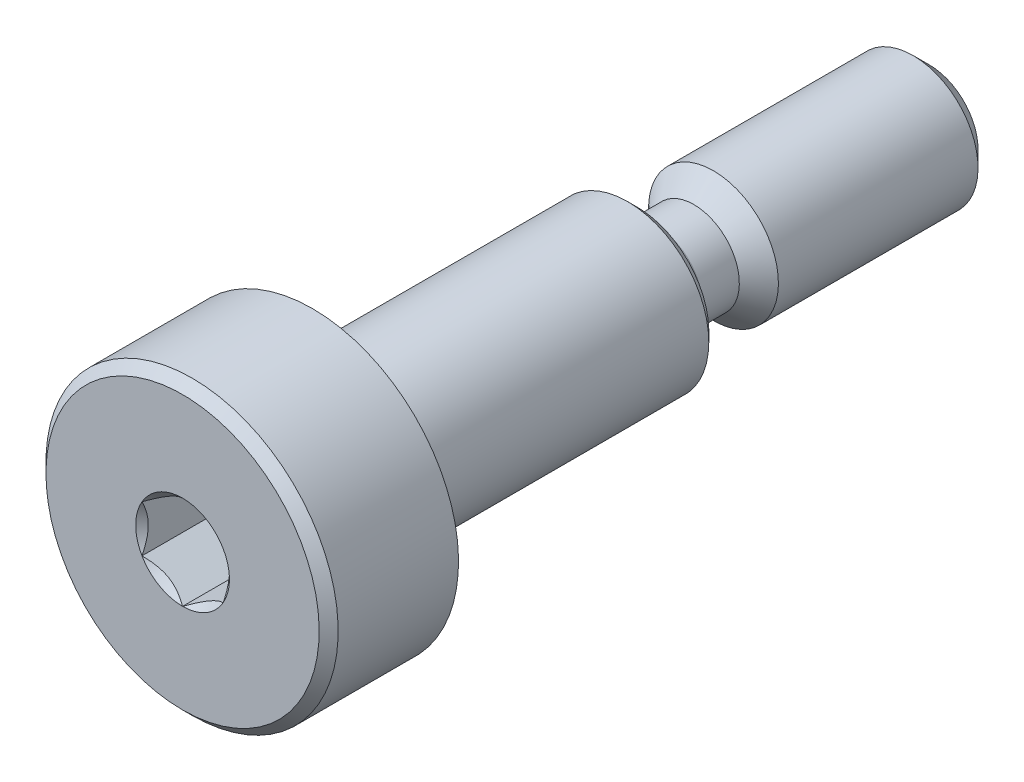
ISO-10303-21;
HEADER;
FILE_DESCRIPTION(('STEP AP214'),'2;1');
FILE_NAME('part.step','',(''),(''),'','','');
FILE_SCHEMA(('AUTOMOTIVE_DESIGN { 1 0 10303 214 1 1 1 1 }'));
ENDSEC;
DATA;
#1=APPLICATION_CONTEXT('core data for automotive mechanical design processes');
#2=APPLICATION_PROTOCOL_DEFINITION('international standard','automotive_design',2000,#1);
#3=PRODUCT_CONTEXT('',#1,'mechanical');
#4=PRODUCT('Part','Part','',(#3));
#5=PRODUCT_RELATED_PRODUCT_CATEGORY('part','',(#4));
#6=PRODUCT_DEFINITION_FORMATION('','',#4);
#7=PRODUCT_DEFINITION_CONTEXT('part definition',#1,'design');
#8=PRODUCT_DEFINITION('design','',#6,#7);
#9=PRODUCT_DEFINITION_SHAPE('','',#8);
#10=(LENGTH_UNIT() NAMED_UNIT(*) SI_UNIT(.MILLI.,.METRE.));
#11=(NAMED_UNIT(*) PLANE_ANGLE_UNIT() SI_UNIT($,.RADIAN.));
#12=(NAMED_UNIT(*) SI_UNIT($,.STERADIAN.) SOLID_ANGLE_UNIT());
#13=UNCERTAINTY_MEASURE_WITH_UNIT(LENGTH_MEASURE(1.E-05),#10,'distance_accuracy_value','');
#14=(GEOMETRIC_REPRESENTATION_CONTEXT(3) GLOBAL_UNCERTAINTY_ASSIGNED_CONTEXT((#13)) GLOBAL_UNIT_ASSIGNED_CONTEXT((#10,
#11,#12)) REPRESENTATION_CONTEXT('',''));
#15=CARTESIAN_POINT('',(0.,0.,0.));
#16=DIRECTION('',(0.,0.,1.));
#17=DIRECTION('',(1.,0.,0.));
#18=AXIS2_PLACEMENT_3D('',#15,#16,#17);
#19=CARTESIAN_POINT('',(0.,0.,-23.));
#20=DIRECTION('',(0.,0.,-1.));
#21=DIRECTION('',(0.,1.,0.));
#22=AXIS2_PLACEMENT_3D('',#19,#20,#21);
#23=CYLINDRICAL_SURFACE('',#22,2.5);
#24=CARTESIAN_POINT('',(0.,0.,-13.7075));
#25=DIRECTION('',(0.,0.,-1.));
#26=DIRECTION('',(0.,1.,0.));
#27=AXIS2_PLACEMENT_3D('',#24,#25,#26);
#28=CIRCLE('',#27,2.5);
#29=CARTESIAN_POINT('',(0.,-2.5,-13.7075));
#30=VERTEX_POINT('',#29);
#31=EDGE_CURVE('E245',#30,#30,#28,.F.);
#32=ORIENTED_EDGE('',*,*,#31,.T.);
#33=EDGE_LOOP('',(#32));
#34=FACE_BOUND('',#33,.T.);
#35=CARTESIAN_POINT('',(0.,0.,-5.16249999999999));
#36=DIRECTION('',(0.,0.,-1.));
#37=DIRECTION('',(0.,1.,0.));
#38=AXIS2_PLACEMENT_3D('',#35,#36,#37);
#39=CIRCLE('',#38,2.5);
#40=CARTESIAN_POINT('',(0.,2.49999999999999,-5.16249999999999));
#41=VERTEX_POINT('',#40);
#42=EDGE_CURVE('E267',#41,#41,#39,.T.);
#43=ORIENTED_EDGE('',*,*,#42,.T.);
#44=EDGE_LOOP('',(#43));
#45=FACE_BOUND('',#44,.T.);
#46=ADVANCED_FACE('F37',(#34,#45),#23,.T.);
#47=CARTESIAN_POINT('',(0.,-2.5,-14.));
#48=DIRECTION('',(0.,0.,-1.));
#49=DIRECTION('',(0.,1.,0.));
#50=AXIS2_PLACEMENT_3D('',#47,#48,#49);
#51=PLANE('',#50);
#52=CARTESIAN_POINT('',(0.,0.,-14.));
#53=DIRECTION('',(0.,0.,-1.));
#54=DIRECTION('',(0.,1.,0.));
#55=AXIS2_PLACEMENT_3D('',#52,#53,#54);
#56=CIRCLE('',#55,2.20749999999999);
#57=CARTESIAN_POINT('',(0.,-2.20749999999999,-14.));
#58=VERTEX_POINT('',#57);
#59=EDGE_CURVE('E248',#58,#58,#56,.T.);
#60=ORIENTED_EDGE('',*,*,#59,.T.);
#61=EDGE_LOOP('',(#60));
#62=FACE_BOUND('',#61,.T.);
#63=CARTESIAN_POINT('',(0.,0.,-14.));
#64=DIRECTION('',(0.,0.,-1.));
#65=DIRECTION('',(0.,1.,0.));
#66=AXIS2_PLACEMENT_3D('',#63,#64,#65);
#67=CIRCLE('',#66,2.00000000000001);
#68=CARTESIAN_POINT('',(0.,2.00000000000001,-14.));
#69=VERTEX_POINT('',#68);
#70=EDGE_CURVE('E287',#69,#69,#67,.T.);
#71=ORIENTED_EDGE('',*,*,#70,.F.);
#72=EDGE_LOOP('',(#71));
#73=FACE_BOUND('',#72,.T.);
#74=ADVANCED_FACE('F199',(#62,#73),#51,.T.);
#75=CARTESIAN_POINT('',(0.,0.,-23.));
#76=DIRECTION('',(0.,0.,-1.));
#77=DIRECTION('',(0.,1.,0.));
#78=AXIS2_PLACEMENT_3D('',#75,#76,#77);
#79=CYLINDRICAL_SURFACE('',#78,1.9);
#80=CARTESIAN_POINT('',(0.,0.,-4.83749999999998));
#81=DIRECTION('',(0.,0.,-1.));
#82=DIRECTION('',(0.,1.,0.));
#83=AXIS2_PLACEMENT_3D('',#80,#81,#82);
#84=CIRCLE('',#83,1.9);
#85=CARTESIAN_POINT('',(0.,1.9,-4.83749999999998));
#86=VERTEX_POINT('',#85);
#87=EDGE_CURVE('E283',#86,#86,#84,.F.);
#88=ORIENTED_EDGE('',*,*,#87,.T.);
#89=EDGE_LOOP('',(#88));
#90=FACE_BOUND('',#89,.T.);
#91=CARTESIAN_POINT('',(0.,0.,-4.));
#92=DIRECTION('',(0.,0.,-1.));
#93=DIRECTION('',(0.,1.,0.));
#94=AXIS2_PLACEMENT_3D('',#91,#92,#93);
#95=CIRCLE('',#94,1.9);
#96=CARTESIAN_POINT('',(0.,1.9,-4.));
#97=VERTEX_POINT('',#96);
#98=EDGE_CURVE('E268',#97,#97,#95,.T.);
#99=ORIENTED_EDGE('',*,*,#98,.T.);
#100=EDGE_LOOP('',(#99));
#101=FACE_BOUND('',#100,.T.);
#102=ADVANCED_FACE('F205',(#90,#101),#79,.T.);
#103=CARTESIAN_POINT('',(0.,2.5,-5.));
#104=DIRECTION('',(0.,0.,-1.));
#105=DIRECTION('',(0.,1.,0.));
#106=AXIS2_PLACEMENT_3D('',#103,#104,#105);
#107=PLANE('',#106);
#108=CARTESIAN_POINT('',(0.,0.,-5.));
#109=DIRECTION('',(0.,0.,-1.));
#110=DIRECTION('',(0.,1.,0.));
#111=AXIS2_PLACEMENT_3D('',#108,#109,#110);
#112=CIRCLE('',#111,2.33750000000001);
#113=CARTESIAN_POINT('',(0.,2.3375,-5.));
#114=VERTEX_POINT('',#113);
#115=EDGE_CURVE('E280',#114,#114,#112,.F.);
#116=ORIENTED_EDGE('',*,*,#115,.T.);
#117=EDGE_LOOP('',(#116));
#118=FACE_BOUND('',#117,.T.);
#119=CARTESIAN_POINT('',(0.,0.,-5.));
#120=DIRECTION('',(0.,0.,-1.));
#121=DIRECTION('',(0.,1.,0.));
#122=AXIS2_PLACEMENT_3D('',#119,#120,#121);
#123=CIRCLE('',#122,2.06250000000001);
#124=CARTESIAN_POINT('',(0.,2.06250000000001,-5.));
#125=VERTEX_POINT('',#124);
#126=EDGE_CURVE('E271',#125,#125,#123,.T.);
#127=ORIENTED_EDGE('',*,*,#126,.T.);
#128=EDGE_LOOP('',(#127));
#129=FACE_BOUND('',#128,.T.);
#130=ADVANCED_FACE('F223',(#118,#129),#107,.F.);
#131=CARTESIAN_POINT('',(0.,0.,0.));
#132=DIRECTION('',(0.,0.,1.));
#133=DIRECTION('',(0.,-1.,0.));
#134=AXIS2_PLACEMENT_3D('',#131,#132,#133);
#135=PLANE('',#134);
#136=CARTESIAN_POINT('',(0.,0.,0.));
#137=DIRECTION('',(0.,0.,1.));
#138=DIRECTION('',(1.,0.,0.));
#139=AXIS2_PLACEMENT_3D('',#136,#137,#138);
#140=CIRCLE('',#139,1.44337567297406);
#141=CARTESIAN_POINT('',(0.,-1.44337567297406,0.));
#142=VERTEX_POINT('',#141);
#143=CARTESIAN_POINT('',(1.25,-0.721687836487032,0.));
#144=VERTEX_POINT('',#143);
#145=EDGE_CURVE('E57',#142,#144,#140,.T.);
#146=ORIENTED_EDGE('',*,*,#145,.F.);
#147=CARTESIAN_POINT('',(-1.25,-0.721687836487031,0.));
#148=VERTEX_POINT('',#147);
#149=EDGE_CURVE('E64',#148,#142,#140,.T.);
#150=ORIENTED_EDGE('',*,*,#149,.F.);
#151=CARTESIAN_POINT('',(-1.25,0.721687836487033,0.));
#152=VERTEX_POINT('',#151);
#153=EDGE_CURVE('E138',#152,#148,#140,.T.);
#154=ORIENTED_EDGE('',*,*,#153,.F.);
#155=CARTESIAN_POINT('',(0.,1.44337567297406,0.));
#156=VERTEX_POINT('',#155);
#157=EDGE_CURVE('E133',#156,#152,#140,.T.);
#158=ORIENTED_EDGE('',*,*,#157,.F.);
#159=CARTESIAN_POINT('',(1.25,0.721687836487034,0.));
#160=VERTEX_POINT('',#159);
#161=EDGE_CURVE('E105',#160,#156,#140,.T.);
#162=ORIENTED_EDGE('',*,*,#161,.F.);
#163=EDGE_CURVE('E96',#144,#160,#140,.T.);
#164=ORIENTED_EDGE('',*,*,#163,.F.);
#165=EDGE_LOOP('',(#146,#150,#154,#158,#162,#164));
#166=FACE_BOUND('',#165,.T.);
#167=CARTESIAN_POINT('',(0.,0.,0.));
#168=DIRECTION('',(0.,0.,1.));
#169=DIRECTION('',(0.,-1.,0.));
#170=AXIS2_PLACEMENT_3D('',#167,#168,#169);
#171=CIRCLE('',#170,4.2075);
#172=CARTESIAN_POINT('',(0.,-4.2075,0.));
#173=VERTEX_POINT('',#172);
#174=EDGE_CURVE('E51',#173,#173,#171,.T.);
#175=ORIENTED_EDGE('',*,*,#174,.T.);
#176=EDGE_LOOP('',(#175));
#177=FACE_BOUND('',#176,.T.);
#178=ADVANCED_FACE('F130',(#166,#177),#135,.T.);
#179=CARTESIAN_POINT('',(0.,0.,-23.));
#180=DIRECTION('',(0.,0.,-1.));
#181=DIRECTION('',(0.,1.,0.));
#182=AXIS2_PLACEMENT_3D('',#179,#180,#181);
#183=CYLINDRICAL_SURFACE('',#182,4.5);
#184=CARTESIAN_POINT('',(0.,0.,-0.292499999999994));
#185=DIRECTION('',(0.,0.,1.));
#186=DIRECTION('',(0.,-1.,0.));
#187=AXIS2_PLACEMENT_3D('',#184,#185,#186);
#188=CIRCLE('',#187,4.5);
#189=CARTESIAN_POINT('',(0.,-4.5,-0.292499999999993));
#190=VERTEX_POINT('',#189);
#191=EDGE_CURVE('E251',#190,#190,#188,.F.);
#192=ORIENTED_EDGE('',*,*,#191,.T.);
#193=EDGE_LOOP('',(#192));
#194=FACE_BOUND('',#193,.T.);
#195=CARTESIAN_POINT('',(0.,0.,-4.));
#196=DIRECTION('',(0.,0.,-1.));
#197=DIRECTION('',(0.,1.,0.));
#198=AXIS2_PLACEMENT_3D('',#195,#196,#197);
#199=CIRCLE('',#198,4.5);
#200=CARTESIAN_POINT('',(0.,4.5,-4.));
#201=VERTEX_POINT('',#200);
#202=EDGE_CURVE('E266',#201,#201,#199,.T.);
#203=ORIENTED_EDGE('',*,*,#202,.F.);
#204=EDGE_LOOP('',(#203));
#205=FACE_BOUND('',#204,.T.);
#206=ADVANCED_FACE('F216',(#194,#205),#183,.T.);
#207=CARTESIAN_POINT('',(0.,-4.5,-4.));
#208=DIRECTION('',(0.,0.,-1.));
#209=DIRECTION('',(0.,1.,0.));
#210=AXIS2_PLACEMENT_3D('',#207,#208,#209);
#211=PLANE('',#210);
#212=ORIENTED_EDGE('',*,*,#202,.T.);
#213=EDGE_LOOP('',(#212));
#214=FACE_BOUND('',#213,.T.);
#215=ORIENTED_EDGE('',*,*,#98,.F.);
#216=EDGE_LOOP('',(#215));
#217=FACE_BOUND('',#216,.T.);
#218=ADVANCED_FACE('F212',(#214,#217),#211,.T.);
#219=CARTESIAN_POINT('',(0.,0.,-5.16249999999999));
#220=DIRECTION('',(0.,0.,-1.));
#221=DIRECTION('',(0.,1.,0.));
#222=AXIS2_PLACEMENT_3D('',#219,#220,#221);
#223=CONICAL_SURFACE('',#222,2.5,0.785398163397452);
#224=ORIENTED_EDGE('',*,*,#115,.F.);
#225=EDGE_LOOP('',(#224));
#226=FACE_BOUND('',#225,.T.);
#227=ORIENTED_EDGE('',*,*,#42,.F.);
#228=EDGE_LOOP('',(#227));
#229=FACE_BOUND('',#228,.T.);
#230=ADVANCED_FACE('F215',(#226,#229),#223,.T.);
#231=CARTESIAN_POINT('',(0.,0.,-5.));
#232=DIRECTION('',(0.,0.,-1.));
#233=DIRECTION('',(0.,1.,0.));
#234=AXIS2_PLACEMENT_3D('',#231,#232,#233);
#235=CONICAL_SURFACE('',#234,2.06250000000001,0.785398163397456);
#236=ORIENTED_EDGE('',*,*,#87,.F.);
#237=EDGE_LOOP('',(#236));
#238=FACE_BOUND('',#237,.T.);
#239=ORIENTED_EDGE('',*,*,#126,.F.);
#240=EDGE_LOOP('',(#239));
#241=FACE_BOUND('',#240,.T.);
#242=ADVANCED_FACE('F226',(#238,#241),#235,.T.);
#243=CARTESIAN_POINT('',(0.,0.,-14.602));
#244=DIRECTION('',(0.,0.,-1.));
#245=DIRECTION('',(0.,1.,0.));
#246=AXIS2_PLACEMENT_3D('',#243,#244,#245);
#247=TOROIDAL_SURFACE('',#246,2.00000000000001,0.602000000000016);
#248=CARTESIAN_POINT('',(0.,0.,-14.602));
#249=DIRECTION('',(0.,0.,-1.));
#250=DIRECTION('',(0.,1.,0.));
#251=AXIS2_PLACEMENT_3D('',#248,#249,#250);
#252=CIRCLE('',#251,1.398);
#253=CARTESIAN_POINT('',(0.,1.39799999999999,-14.602));
#254=VERTEX_POINT('',#253);
#255=EDGE_CURVE('E352',#254,#254,#252,.T.);
#256=ORIENTED_EDGE('',*,*,#255,.F.);
#257=EDGE_LOOP('',(#256));
#258=FACE_BOUND('',#257,.T.);
#259=ORIENTED_EDGE('',*,*,#70,.T.);
#260=EDGE_LOOP('',(#259));
#261=FACE_BOUND('',#260,.T.);
#262=ADVANCED_FACE('F230',(#258,#261),#247,.F.);
#263=CARTESIAN_POINT('',(0.,0.,-23.));
#264=DIRECTION('',(0.,0.,-1.));
#265=DIRECTION('',(0.,1.,0.));
#266=AXIS2_PLACEMENT_3D('',#263,#264,#265);
#267=CYLINDRICAL_SURFACE('',#266,1.398);
#268=CARTESIAN_POINT('',(0.,0.,-15.75));
#269=DIRECTION('',(0.,0.,-1.));
#270=DIRECTION('',(0.,1.,0.));
#271=AXIS2_PLACEMENT_3D('',#268,#269,#270);
#272=CIRCLE('',#271,1.398);
#273=CARTESIAN_POINT('',(0.,1.39799999999999,-15.75));
#274=VERTEX_POINT('',#273);
#275=EDGE_CURVE('E341',#274,#274,#272,.T.);
#276=ORIENTED_EDGE('',*,*,#275,.F.);
#277=EDGE_LOOP('',(#276));
#278=FACE_BOUND('',#277,.T.);
#279=ORIENTED_EDGE('',*,*,#255,.T.);
#280=EDGE_LOOP('',(#279));
#281=FACE_BOUND('',#280,.T.);
#282=ADVANCED_FACE('F301',(#278,#281),#267,.T.);
#283=CARTESIAN_POINT('',(0.,0.,-15.75));
#284=DIRECTION('',(0.,0.,-1.));
#285=DIRECTION('',(0.,1.,0.));
#286=AXIS2_PLACEMENT_3D('',#283,#284,#285);
#287=CONICAL_SURFACE('',#286,1.398,0.785398163397446);
#288=CARTESIAN_POINT('',(0.,0.,-16.352));
#289=DIRECTION('',(0.,0.,-1.));
#290=DIRECTION('',(0.,1.,0.));
#291=AXIS2_PLACEMENT_3D('',#288,#289,#290);
#292=CIRCLE('',#291,2.00000000000001);
#293=CARTESIAN_POINT('',(0.,2.00000000000001,-16.352));
#294=VERTEX_POINT('',#293);
#295=EDGE_CURVE('E274',#294,#294,#292,.F.);
#296=ORIENTED_EDGE('',*,*,#295,.T.);
#297=EDGE_LOOP('',(#296));
#298=FACE_BOUND('',#297,.T.);
#299=ORIENTED_EDGE('',*,*,#275,.T.);
#300=EDGE_LOOP('',(#299));
#301=FACE_BOUND('',#300,.T.);
#302=ADVANCED_FACE('F294',(#298,#301),#287,.T.);
#303=CARTESIAN_POINT('',(0.,-2.00000000000002,-23.));
#304=DIRECTION('',(0.,0.,-1.));
#305=DIRECTION('',(0.,1.,0.));
#306=AXIS2_PLACEMENT_3D('',#303,#304,#305);
#307=PLANE('',#306);
#308=CARTESIAN_POINT('',(0.,0.,-23.));
#309=DIRECTION('',(0.,0.,-1.));
#310=DIRECTION('',(0.,1.,0.));
#311=AXIS2_PLACEMENT_3D('',#308,#309,#310);
#312=CIRCLE('',#311,1.50000000000001);
#313=CARTESIAN_POINT('',(0.,1.50000000000001,-23.));
#314=VERTEX_POINT('',#313);
#315=EDGE_CURVE('E254',#314,#314,#312,.T.);
#316=ORIENTED_EDGE('',*,*,#315,.T.);
#317=EDGE_LOOP('',(#316));
#318=FACE_BOUND('',#317,.T.);
#319=ADVANCED_FACE('F291',(#318),#307,.T.);
#320=CARTESIAN_POINT('',(0.,0.,-23.));
#321=DIRECTION('',(0.,0.,-1.));
#322=DIRECTION('',(0.,1.,0.));
#323=AXIS2_PLACEMENT_3D('',#320,#321,#322);
#324=CYLINDRICAL_SURFACE('',#323,2.00000000000001);
#325=CARTESIAN_POINT('',(0.,0.,-22.5));
#326=DIRECTION('',(0.,0.,-1.));
#327=DIRECTION('',(0.,1.,0.));
#328=AXIS2_PLACEMENT_3D('',#325,#326,#327);
#329=CIRCLE('',#328,2.00000000000001);
#330=CARTESIAN_POINT('',(0.,2.00000000000001,-22.5));
#331=VERTEX_POINT('',#330);
#332=EDGE_CURVE('E249',#331,#331,#329,.F.);
#333=ORIENTED_EDGE('',*,*,#332,.T.);
#334=EDGE_LOOP('',(#333));
#335=FACE_BOUND('',#334,.T.);
#336=ORIENTED_EDGE('',*,*,#295,.F.);
#337=EDGE_LOOP('',(#336));
#338=FACE_BOUND('',#337,.T.);
#339=ADVANCED_FACE('F235',(#335,#338),#324,.T.);
#340=CARTESIAN_POINT('',(0.,0.,-23.));
#341=DIRECTION('',(0.,0.,1.));
#342=DIRECTION('',(0.,-1.,0.));
#343=AXIS2_PLACEMENT_3D('',#340,#341,#342);
#344=CONICAL_SURFACE('',#343,1.50000000000002,0.785398163397448);
#345=ORIENTED_EDGE('',*,*,#332,.F.);
#346=EDGE_LOOP('',(#345));
#347=FACE_BOUND('',#346,.T.);
#348=ORIENTED_EDGE('',*,*,#315,.F.);
#349=EDGE_LOOP('',(#348));
#350=FACE_BOUND('',#349,.T.);
#351=ADVANCED_FACE('F232',(#347,#350),#344,.T.);
#352=CARTESIAN_POINT('',(0.,0.,-14.));
#353=DIRECTION('',(0.,0.,1.));
#354=DIRECTION('',(0.,-1.,0.));
#355=AXIS2_PLACEMENT_3D('',#352,#353,#354);
#356=CONICAL_SURFACE('',#355,2.20749999999999,0.78539816339745);
#357=CARTESIAN_POINT('',(0.,-2.5,-13.7075));
#358=CARTESIAN_POINT('',(0.,-2.496953125,-13.710546875));
#359=CARTESIAN_POINT('',(0.,-2.49390625,-13.71359375));
#360=CARTESIAN_POINT('',(0.,-2.4878125,-13.7196875));
#361=CARTESIAN_POINT('',(0.,-2.484765625,-13.722734375));
#362=CARTESIAN_POINT('',(0.,-2.478671875,-13.728828125));
#363=CARTESIAN_POINT('',(0.,-2.475625,-13.731875));
#364=CARTESIAN_POINT('',(0.,-2.46953125,-13.73796875));
#365=CARTESIAN_POINT('',(0.,-2.466484375,-13.741015625));
#366=CARTESIAN_POINT('',(0.,-2.460390625,-13.747109375));
#367=CARTESIAN_POINT('',(0.,-2.45734375,-13.75015625));
#368=CARTESIAN_POINT('',(0.,-2.45125,-13.75625));
#369=CARTESIAN_POINT('',(0.,-2.448203125,-13.759296875));
#370=CARTESIAN_POINT('',(0.,-2.442109375,-13.765390625));
#371=CARTESIAN_POINT('',(0.,-2.4390625,-13.7684375));
#372=CARTESIAN_POINT('',(0.,-2.43296875,-13.77453125));
#373=CARTESIAN_POINT('',(0.,-2.429921875,-13.777578125));
#374=CARTESIAN_POINT('',(0.,-2.423828125,-13.783671875));
#375=CARTESIAN_POINT('',(0.,-2.42078125,-13.78671875));
#376=CARTESIAN_POINT('',(0.,-2.4146875,-13.7928125));
#377=CARTESIAN_POINT('',(0.,-2.411640625,-13.795859375));
#378=CARTESIAN_POINT('',(0.,-2.405546875,-13.801953125));
#379=CARTESIAN_POINT('',(0.,-2.4025,-13.805));
#380=CARTESIAN_POINT('',(0.,-2.39640625,-13.81109375));
#381=CARTESIAN_POINT('',(0.,-2.393359375,-13.814140625));
#382=CARTESIAN_POINT('',(0.,-2.387265625,-13.820234375));
#383=CARTESIAN_POINT('',(0.,-2.38421875,-13.82328125));
#384=CARTESIAN_POINT('',(0.,-2.378125,-13.829375));
#385=CARTESIAN_POINT('',(0.,-2.375078125,-13.832421875));
#386=CARTESIAN_POINT('',(0.,-2.368984375,-13.838515625));
#387=CARTESIAN_POINT('',(0.,-2.3659375,-13.8415625));
#388=CARTESIAN_POINT('',(0.,-2.35984375,-13.84765625));
#389=CARTESIAN_POINT('',(0.,-2.356796875,-13.850703125));
#390=CARTESIAN_POINT('',(0.,-2.350703125,-13.856796875));
#391=CARTESIAN_POINT('',(0.,-2.34765625,-13.85984375));
#392=CARTESIAN_POINT('',(0.,-2.3415625,-13.8659375));
#393=CARTESIAN_POINT('',(0.,-2.338515625,-13.868984375));
#394=CARTESIAN_POINT('',(0.,-2.332421875,-13.875078125));
#395=CARTESIAN_POINT('',(0.,-2.329375,-13.878125));
#396=CARTESIAN_POINT('',(0.,-2.32328125,-13.88421875));
#397=CARTESIAN_POINT('',(0.,-2.320234375,-13.887265625));
#398=CARTESIAN_POINT('',(0.,-2.314140625,-13.893359375));
#399=CARTESIAN_POINT('',(0.,-2.31109375,-13.89640625));
#400=CARTESIAN_POINT('',(0.,-2.305,-13.9025));
#401=CARTESIAN_POINT('',(0.,-2.301953125,-13.905546875));
#402=CARTESIAN_POINT('',(0.,-2.295859375,-13.911640625));
#403=CARTESIAN_POINT('',(0.,-2.2928125,-13.9146875));
#404=CARTESIAN_POINT('',(0.,-2.28671875,-13.92078125));
#405=CARTESIAN_POINT('',(0.,-2.283671875,-13.923828125));
#406=CARTESIAN_POINT('',(0.,-2.277578125,-13.929921875));
#407=CARTESIAN_POINT('',(0.,-2.27453125,-13.93296875));
#408=CARTESIAN_POINT('',(0.,-2.2684375,-13.9390625));
#409=CARTESIAN_POINT('',(0.,-2.265390625,-13.942109375));
#410=CARTESIAN_POINT('',(0.,-2.259296875,-13.948203125));
#411=CARTESIAN_POINT('',(0.,-2.25625,-13.95125));
#412=CARTESIAN_POINT('',(0.,-2.25015625,-13.95734375));
#413=CARTESIAN_POINT('',(0.,-2.24710937499999,-13.960390625));
#414=CARTESIAN_POINT('',(0.,-2.24101562499999,-13.966484375));
#415=CARTESIAN_POINT('',(0.,-2.23796874999999,-13.96953125));
#416=CARTESIAN_POINT('',(0.,-2.23187499999999,-13.975625));
#417=CARTESIAN_POINT('',(0.,-2.22882812499999,-13.978671875));
#418=CARTESIAN_POINT('',(0.,-2.22273437499999,-13.984765625));
#419=CARTESIAN_POINT('',(0.,-2.21968749999999,-13.9878125));
#420=CARTESIAN_POINT('',(0.,-2.21359374999999,-13.99390625));
#421=CARTESIAN_POINT('',(0.,-2.21054687499999,-13.996953125));
#422=CARTESIAN_POINT('',(0.,-2.20749999999999,-14.));
#423=B_SPLINE_CURVE_WITH_KNOTS('',3,(#357,#358,#359,#360,#361,#362,#363,#364,#365,#366,#367,
#368,#369,#370,#371,#372,#373,#374,#375,#376,#377,#378,#379,#380,#381,#382,#383,#384,#385,#386,
#387,#388,#389,#390,#391,#392,#393,#394,#395,#396,#397,#398,#399,#400,#401,#402,#403,#404,#405,
#406,#407,#408,#409,#410,#411,#412,#413,#414,#415,#416,#417,#418,#419,#420,#421,#422),
.UNSPECIFIED.,.F.,.F.,(4,2,2,2,2,2,2,2,2,2,2,2,2,2,2,2,2,2,2,2,2,2,2,2,2,2,2,2,2,2,2,2,4),(0.,
0.012926795843566,0.0258535916871335,0.0387803875306996,0.0517071833742668,0.0646339792178331,
0.0775607750614003,0.0904875709049663,0.103414366748534,0.116341162592101,0.129267958435667,
0.142194754279235,0.155121550122801,0.168048345966368,0.180975141809934,0.193901937653501,
0.206828733497069,0.219755529340635,0.232682325184202,0.245609121027769,0.258535916871336,
0.271462712714902,0.284389508558469,0.297316304402035,0.310243100245603,0.32316989608917,
0.336096691932736,0.349023487776303,0.36195028361987,0.374877079463437,0.387803875307003,
0.40073067115057,0.413657466994138),.UNSPECIFIED.);
#424=EDGE_CURVE('BSEAM234',#30,#58,#423,.T.);
#425=ORIENTED_EDGE('',*,*,#31,.F.);
#426=ORIENTED_EDGE('',*,*,#59,.F.);
#427=ORIENTED_EDGE('',*,*,#424,.T.);
#428=ORIENTED_EDGE('',*,*,#424,.F.);
#429=EDGE_LOOP('',(#425,#427,#426,#428));
#430=FACE_BOUND('',#429,.T.);
#431=ADVANCED_FACE('F234',(#430),#356,.T.);
#432=CARTESIAN_POINT('',(0.,0.,-0.292499999999994));
#433=DIRECTION('',(0.,0.,-1.));
#434=DIRECTION('',(0.,1.,0.));
#435=AXIS2_PLACEMENT_3D('',#432,#433,#434);
#436=CONICAL_SURFACE('',#435,4.5,0.78539816339745);
#437=ORIENTED_EDGE('',*,*,#174,.F.);
#438=EDGE_LOOP('',(#437));
#439=FACE_BOUND('',#438,.T.);
#440=ORIENTED_EDGE('',*,*,#191,.F.);
#441=EDGE_LOOP('',(#440));
#442=FACE_BOUND('',#441,.T.);
#443=ADVANCED_FACE('F39',(#439,#442),#436,.T.);
#444=CARTESIAN_POINT('',(0.,0.,0.));
#445=DIRECTION('',(0.,0.,1.));
#446=DIRECTION('',(1.,0.,0.));
#447=AXIS2_PLACEMENT_3D('',#444,#445,#446);
#448=CONICAL_SURFACE('',#447,1.44337567297406,0.78539816339745);
#449=ORIENTED_EDGE('',*,*,#161,.T.);
#450=CARTESIAN_POINT('',(1.2502,0.721572366433195,0.000115483909136239));
#451=CARTESIAN_POINT('',(1.20722483292841,0.746384090710445,-0.0246783319448961));
#452=CARTESIAN_POINT('',(1.16353099525405,0.771610739653665,-0.0480162655813162));
#453=CARTESIAN_POINT('',(1.07443406915806,0.823050873919155,-0.0907479959154631));
#454=CARTESIAN_POINT('',(1.02902250164294,0.849269254648334,-0.110118007639586));
#455=CARTESIAN_POINT('',(0.937452179064741,0.902137405038636,-0.143299516586523));
#456=CARTESIAN_POINT('',(0.891316759824115,0.928773701756388,-0.157194440947344));
#457=CARTESIAN_POINT('',(0.798029919592408,0.982632884076013,-0.178602717839361));
#458=CARTESIAN_POINT('',(0.750881350863621,1.00985412292348,-0.186132058433212));
#459=CARTESIAN_POINT('',(0.669626443112748,1.05676666578643,-0.192925501949297));
#460=CARTESIAN_POINT('',(0.63562512337206,1.07639733689152,-0.19393144089565));
#461=CARTESIAN_POINT('',(0.567682235567523,1.11562418145499,-0.192238585088681));
#462=CARTESIAN_POINT('',(0.533740682344343,1.1352203463451,-0.189538972784461));
#463=CARTESIAN_POINT('',(0.466185143542501,1.1742235548576,-0.180591069683622));
#464=CARTESIAN_POINT('',(0.432571492713226,1.19363040521233,-0.174339474100294));
#465=CARTESIAN_POINT('',(0.365905361782188,1.23212011385119,-0.158624318586096));
#466=CARTESIAN_POINT('',(0.332853128969705,1.2512028293628,-0.149159379912541));
#467=CARTESIAN_POINT('',(0.248200308399736,1.30007715810653,-0.121068609312414));
#468=CARTESIAN_POINT('',(0.197133507570362,1.32956058931202,-0.100329842547799));
#469=CARTESIAN_POINT('',(0.0969991458867455,1.38737318998519,-0.0536128653285232));
#470=CARTESIAN_POINT('',(0.0479256884217309,1.41570576386268,-0.0276517040532334));
#471=CARTESIAN_POINT('',(-0.00019999999999979,1.4434911430279,0.000115483909136579));
#472=B_SPLINE_CURVE_WITH_KNOTS('',3,(#450,#451,#452,#453,#454,#455,#456,#457,#458,#459,#460,
#461,#462,#463,#464,#465,#466,#467,#468,#469,#470,#471),.UNSPECIFIED.,.F.,.F.,(4,2,2,2,2,2,2,2,
2,2,4),(0.,0.166533409618303,0.334037607289761,0.498880396489697,0.663307919240273,
0.780963963458825,0.898645970148452,1.01643764860773,1.13427993171549,1.32148652032141,
1.50809158792573),.UNSPECIFIED.);
#473=EDGE_CURVE('E11',#160,#156,#472,.T.);
#474=ORIENTED_EDGE('',*,*,#473,.F.);
#475=EDGE_LOOP('',(#449,#474));
#476=FACE_BOUND('',#475,.T.);
#477=ADVANCED_FACE('F108',(#476),#448,.F.);
#478=ORIENTED_EDGE('',*,*,#157,.T.);
#479=CARTESIAN_POINT('',(0.00020000000000023,1.4434911430279,0.000115483909136542));
#480=CARTESIAN_POINT('',(-0.0427751670715864,1.41867941875065,-0.024678331944896));
#481=CARTESIAN_POINT('',(-0.0864690047459479,1.39345276980743,-0.0480162655813161));
#482=CARTESIAN_POINT('',(-0.175565930841942,1.34201263554194,-0.090747995915463));
#483=CARTESIAN_POINT('',(-0.220977498357064,1.31579425481276,-0.110118007639586));
#484=CARTESIAN_POINT('',(-0.31254782093526,1.26292610442246,-0.143299516586523));
#485=CARTESIAN_POINT('',(-0.358683240175886,1.23628980770471,-0.157194440947344));
#486=CARTESIAN_POINT('',(-0.451970080407592,1.18243062538508,-0.178602717839361));
#487=CARTESIAN_POINT('',(-0.49911864913638,1.15520938653761,-0.186132058433213));
#488=CARTESIAN_POINT('',(-0.580373556887252,1.10829684367467,-0.192925501949297));
#489=CARTESIAN_POINT('',(-0.614374876627941,1.08866617256958,-0.19393144089565));
#490=CARTESIAN_POINT('',(-0.682317764432477,1.04943932800611,-0.192238585088681));
#491=CARTESIAN_POINT('',(-0.716259317655657,1.02984316311599,-0.189538972784462));
#492=CARTESIAN_POINT('',(-0.783814856457499,0.9908399546035,-0.180591069683623));
#493=CARTESIAN_POINT('',(-0.817428507286775,0.971433104248772,-0.174339474100294));
#494=CARTESIAN_POINT('',(-0.884094638217813,0.932943395609906,-0.158624318586096));
#495=CARTESIAN_POINT('',(-0.917146871030295,0.913860680098301,-0.149159379912541));
#496=CARTESIAN_POINT('',(-1.00179969160026,0.864986351354568,-0.121068609312414));
#497=CARTESIAN_POINT('',(-1.05286649242964,0.835502920149076,-0.100329842547799));
#498=CARTESIAN_POINT('',(-1.15300085411325,0.777690319475909,-0.0536128653285237));
#499=CARTESIAN_POINT('',(-1.20207431157827,0.749357745598417,-0.027651704053234));
#500=CARTESIAN_POINT('',(-1.2502,0.721572366433195,0.000115483909135921));
#501=B_SPLINE_CURVE_WITH_KNOTS('',3,(#479,#480,#481,#482,#483,#484,#485,#486,#487,#488,#489,
#490,#491,#492,#493,#494,#495,#496,#497,#498,#499,#500),.UNSPECIFIED.,.F.,.F.,(4,2,2,2,2,2,2,2,
2,2,4),(0.,0.166533409618304,0.334037607289762,0.498880396489698,0.663307919240275,
0.780963963458827,0.898645970148453,1.01643764860773,1.1342799317155,1.32148652032141,
1.50809158792573),.UNSPECIFIED.);
#502=EDGE_CURVE('E134',#156,#152,#501,.T.);
#503=ORIENTED_EDGE('',*,*,#502,.F.);
#504=EDGE_LOOP('',(#478,#503));
#505=FACE_BOUND('',#504,.T.);
#506=ADVANCED_FACE('F373',(#505),#448,.F.);
#507=ORIENTED_EDGE('',*,*,#153,.T.);
#508=CARTESIAN_POINT('',(-1.25,-1.43934010808077,0.462982096892325));
#509=CARTESIAN_POINT('',(-1.25,-1.40429313005658,0.436524922632887));
#510=CARTESIAN_POINT('',(-1.25,-1.36905087135599,0.410327160354277));
#511=CARTESIAN_POINT('',(-1.25,-1.29809650706311,0.358557571839582));
#512=CARTESIAN_POINT('',(-1.25,-1.26238428576495,0.332985904356292));
#513=CARTESIAN_POINT('',(-1.25,-1.15390111792708,0.257005993689462));
#514=CARTESIAN_POINT('',(-1.25,-1.08031646726264,0.207740286189565));
#515=CARTESIAN_POINT('',(-1.25,-0.926012322755094,0.11102583026313));
#516=CARTESIAN_POINT('',(-1.25,-0.845125318656145,0.0638412989417951));
#517=CARTESIAN_POINT('',(-1.25,-0.679311174076601,-0.0224692656095877));
#518=CARTESIAN_POINT('',(-1.25,-0.594398891026687,-0.0616224653731007));
#519=CARTESIAN_POINT('',(-1.25,-0.466944812460739,-0.109522776311709));
#520=CARTESIAN_POINT('',(-1.25,-0.426289985812821,-0.123270510213665));
#521=CARTESIAN_POINT('',(-1.25,-0.343998850091267,-0.147502072549458));
#522=CARTESIAN_POINT('',(-1.25,-0.302362473614961,-0.157985676130229));
#523=CARTESIAN_POINT('',(-1.25,-0.219052696285665,-0.174969838251704));
#524=CARTESIAN_POINT('',(-1.25,-0.177393428474499,-0.181538639528632));
#525=CARTESIAN_POINT('',(-1.25,-0.0936293693401913,-0.190564946542242));
#526=CARTESIAN_POINT('',(-1.25,-0.0515246558543953,-0.193023159002733));
#527=CARTESIAN_POINT('',(-1.25,0.0311890576306321,-0.193645937986716));
#528=CARTESIAN_POINT('',(-1.25,0.0717969625499308,-0.191962883153754));
#529=CARTESIAN_POINT('',(-1.25,0.152668636885198,-0.184731729402087));
#530=CARTESIAN_POINT('',(-1.25,0.192932338835358,-0.179182889586893));
#531=CARTESIAN_POINT('',(-1.25,0.273499879165295,-0.164428963535047));
#532=CARTESIAN_POINT('',(-1.25,0.313792180618511,-0.155161824035895));
#533=CARTESIAN_POINT('',(-1.25,0.393496413911457,-0.133463821542654));
#534=CARTESIAN_POINT('',(-1.25,0.432908419115059,-0.121033223269356));
#535=CARTESIAN_POINT('',(-1.25,0.556992735862298,-0.0772206470685637));
#536=CARTESIAN_POINT('',(-1.25,0.639898924666086,-0.0408489271240448));
#537=CARTESIAN_POINT('',(-1.25,0.801816555499702,0.0400191621783344));
#538=CARTESIAN_POINT('',(-1.25,0.880812666325045,0.0845447209119855));
#539=CARTESIAN_POINT('',(-1.25,1.0317856127975,0.176404876666624));
#540=CARTESIAN_POINT('',(-1.25,1.10391618485086,0.223489933916249));
#541=CARTESIAN_POINT('',(-1.25,1.21018606043311,0.296278561598538));
#542=CARTESIAN_POINT('',(-1.25,1.24515069969379,0.320798085393358));
#543=CARTESIAN_POINT('',(-1.25,1.31460220852736,0.37048563676568));
#544=CARTESIAN_POINT('',(-1.25,1.34908920596618,0.39565348541552));
#545=CARTESIAN_POINT('',(-1.25,1.38337731682912,0.421090148841213));
#546=B_SPLINE_CURVE_WITH_KNOTS('',3,(#508,#509,#510,#511,#512,#513,#514,#515,#516,#517,#518,
#519,#520,#521,#522,#523,#524,#525,#526,#527,#528,#529,#530,#531,#532,#533,#534,#535,#536,#537,
#538,#539,#540,#541,#542,#543,#544,#545),.UNSPECIFIED.,.F.,.F.,(4,2,2,2,2,2,2,2,2,2,2,2,2,2,2,2,
2,2,4),(0.,0.131732960381448,0.263498984161645,0.529042014455825,0.809741926134617,
1.08947609717225,1.21811634272576,1.346765447839,1.47310084517844,1.59941451973784,
1.72115042167849,1.84290966131735,1.96679153905341,2.09066305366039,2.36146692896009,
2.63325989198491,2.89154668212279,3.01965734507713,3.14773302245628),.UNSPECIFIED.);
#547=EDGE_CURVE('E136',#152,#148,#546,.F.);
#548=ORIENTED_EDGE('',*,*,#547,.F.);
#549=EDGE_LOOP('',(#507,#548));
#550=FACE_BOUND('',#549,.T.);
#551=ADVANCED_FACE('F370',(#550),#448,.F.);
#552=ORIENTED_EDGE('',*,*,#149,.T.);
#553=CARTESIAN_POINT('',(-1.2502,-0.721572366433193,0.000115483909134722));
#554=CARTESIAN_POINT('',(-1.20722483292841,-0.746384090710443,-0.0246783319448976));
#555=CARTESIAN_POINT('',(-1.16353099525405,-0.771610739653663,-0.0480162655813177));
#556=CARTESIAN_POINT('',(-1.07443406915806,-0.823050873919153,-0.0907479959154645));
#557=CARTESIAN_POINT('',(-1.02902250164294,-0.849269254648332,-0.110118007639587));
#558=CARTESIAN_POINT('',(-0.93745217906474,-0.902137405038634,-0.143299516586524));
#559=CARTESIAN_POINT('',(-0.891316759824114,-0.928773701756386,-0.157194440947345));
#560=CARTESIAN_POINT('',(-0.798029919592408,-0.982632884076011,-0.178602717839363));
#561=CARTESIAN_POINT('',(-0.75088135086362,-1.00985412292348,-0.186132058433215));
#562=CARTESIAN_POINT('',(-0.669626443112748,-1.05676666578643,-0.192925501949298));
#563=CARTESIAN_POINT('',(-0.635625123372059,-1.07639733689152,-0.193931440895651));
#564=CARTESIAN_POINT('',(-0.567682235567523,-1.11562418145499,-0.192238585088683));
#565=CARTESIAN_POINT('',(-0.533740682344343,-1.1352203463451,-0.189538972784463));
#566=CARTESIAN_POINT('',(-0.466185143542501,-1.1742235548576,-0.180591069683624));
#567=CARTESIAN_POINT('',(-0.432571492713226,-1.19363040521232,-0.174339474100296));
#568=CARTESIAN_POINT('',(-0.365905361782188,-1.23212011385119,-0.158624318586098));
#569=CARTESIAN_POINT('',(-0.332853128969705,-1.25120282936279,-0.149159379912543));
#570=CARTESIAN_POINT('',(-0.248200308399736,-1.30007715810653,-0.121068609312416));
#571=CARTESIAN_POINT('',(-0.197133507570362,-1.32956058931202,-0.100329842547801));
#572=CARTESIAN_POINT('',(-0.0969991458867454,-1.38737318998519,-0.0536128653285253));
#573=CARTESIAN_POINT('',(-0.0479256884217307,-1.41570576386268,-0.0276517040532354));
#574=CARTESIAN_POINT('',(0.000199999999999905,-1.4434911430279,0.000115483909134745));
#575=B_SPLINE_CURVE_WITH_KNOTS('',3,(#553,#554,#555,#556,#557,#558,#559,#560,#561,#562,#563,
#564,#565,#566,#567,#568,#569,#570,#571,#572,#573,#574),.UNSPECIFIED.,.F.,.F.,(4,2,2,2,2,2,2,2,
2,2,4),(0.,0.166533409618303,0.334037607289761,0.498880396489697,0.663307919240274,
0.780963963458826,0.898645970148452,1.01643764860773,1.13427993171549,1.32148652032141,
1.50809158792573),.UNSPECIFIED.);
#576=EDGE_CURVE('E164',#148,#142,#575,.T.);
#577=ORIENTED_EDGE('',*,*,#576,.F.);
#578=EDGE_LOOP('',(#552,#577));
#579=FACE_BOUND('',#578,.T.);
#580=ADVANCED_FACE('F372',(#579),#448,.F.);
#581=ORIENTED_EDGE('',*,*,#145,.T.);
#582=CARTESIAN_POINT('',(-0.000200000000000173,-1.4434911430279,0.000115483909134591));
#583=CARTESIAN_POINT('',(0.0427751670715864,-1.41867941875065,-0.0246783319448978));
#584=CARTESIAN_POINT('',(0.0864690047459476,-1.39345276980743,-0.0480162655813178));
#585=CARTESIAN_POINT('',(0.175565930841941,-1.34201263554194,-0.0907479959154645));
#586=CARTESIAN_POINT('',(0.220977498357063,-1.31579425481276,-0.110118007639587));
#587=CARTESIAN_POINT('',(0.312547820935259,-1.26292610442246,-0.143299516586524));
#588=CARTESIAN_POINT('',(0.358683240175885,-1.23628980770471,-0.157194440947345));
#589=CARTESIAN_POINT('',(0.451970080407591,-1.18243062538508,-0.178602717839362));
#590=CARTESIAN_POINT('',(0.499118649136378,-1.15520938653761,-0.186132058433214));
#591=CARTESIAN_POINT('',(0.580373556887251,-1.10829684367467,-0.192925501949298));
#592=CARTESIAN_POINT('',(0.61437487662794,-1.08866617256958,-0.193931440895651));
#593=CARTESIAN_POINT('',(0.682317764432476,-1.04943932800611,-0.192238585088682));
#594=CARTESIAN_POINT('',(0.716259317655656,-1.02984316311599,-0.189538972784463));
#595=CARTESIAN_POINT('',(0.783814856457498,-0.990839954603499,-0.180591069683624));
#596=CARTESIAN_POINT('',(0.817428507286774,-0.971433104248771,-0.174339474100296));
#597=CARTESIAN_POINT('',(0.884094638217812,-0.932943395609905,-0.158624318586097));
#598=CARTESIAN_POINT('',(0.917146871030294,-0.9138606800983,-0.149159379912543));
#599=CARTESIAN_POINT('',(1.00179969160026,-0.864986351354567,-0.121068609312415));
#600=CARTESIAN_POINT('',(1.05286649242964,-0.835502920149075,-0.100329842547801));
#601=CARTESIAN_POINT('',(1.15300085411325,-0.777690319475908,-0.0536128653285246));
#602=CARTESIAN_POINT('',(1.20207431157827,-0.749357745598416,-0.0276517040532346));
#603=CARTESIAN_POINT('',(1.2502,-0.721572366433194,0.000115483909135691));
#604=B_SPLINE_CURVE_WITH_KNOTS('',3,(#582,#583,#584,#585,#586,#587,#588,#589,#590,#591,#592,
#593,#594,#595,#596,#597,#598,#599,#600,#601,#602,#603),.UNSPECIFIED.,.F.,.F.,(4,2,2,2,2,2,2,2,
2,2,4),(0.,0.166533409618303,0.334037607289761,0.498880396489697,0.663307919240273,
0.780963963458825,0.898645970148451,1.01643764860773,1.13427993171549,1.32148652032141,
1.50809158792574),.UNSPECIFIED.);
#605=EDGE_CURVE('E120',#142,#144,#604,.T.);
#606=ORIENTED_EDGE('',*,*,#605,.F.);
#607=EDGE_LOOP('',(#581,#606));
#608=FACE_BOUND('',#607,.T.);
#609=ADVANCED_FACE('F157',(#608),#448,.F.);
#610=ORIENTED_EDGE('',*,*,#163,.T.);
#611=CARTESIAN_POINT('',(1.25,-1.43934010829019,0.462982097050439));
#612=CARTESIAN_POINT('',(1.25,-1.40429313026013,0.436524922784911));
#613=CARTESIAN_POINT('',(1.25,-1.36905087155364,0.410327160500221));
#614=CARTESIAN_POINT('',(1.25,-1.29809650724891,0.358557571973401));
#615=CARTESIAN_POINT('',(1.25,-1.2623842859448,0.332985904484065));
#616=CARTESIAN_POINT('',(1.25,-1.1539011180887,0.257005993798985));
#617=CARTESIAN_POINT('',(1.25,-1.08031646741187,0.207740286286972));
#618=CARTESIAN_POINT('',(1.25,-0.926012322877301,0.111025830335616));
#619=CARTESIAN_POINT('',(1.25,-0.845125318763647,0.0638412990015671));
#620=CARTESIAN_POINT('',(1.25,-0.679311174153443,-0.0224692655733857));
#621=CARTESIAN_POINT('',(1.25,-0.594398891087583,-0.0616224653477706));
#622=CARTESIAN_POINT('',(1.25,-0.466944812509638,-0.109522776294448));
#623=CARTESIAN_POINT('',(1.25,-0.426289985866744,-0.123270510196089));
#624=CARTESIAN_POINT('',(1.25,-0.343998850155402,-0.14750207253227));
#625=CARTESIAN_POINT('',(1.25,-0.302362473684285,-0.157985676113742));
#626=CARTESIAN_POINT('',(1.25,-0.219052696365194,-0.174969838237797));
#627=CARTESIAN_POINT('',(1.25,-0.177393428559043,-0.181538639516573));
#628=CARTESIAN_POINT('',(1.25,-0.0936293694345974,-0.190564946535012));
#629=CARTESIAN_POINT('',(1.25,-0.0515246559536483,-0.193023158998485));
#630=CARTESIAN_POINT('',(1.25,0.0311890575224393,-0.193645937989275));
#631=CARTESIAN_POINT('',(1.25,0.0717969624376325,-0.191962883160083));
#632=CARTESIAN_POINT('',(1.25,0.152668636765093,-0.184731729416541));
#633=CARTESIAN_POINT('',(1.25,0.192932338711554,-0.179182889605703));
#634=CARTESIAN_POINT('',(1.25,0.273499879034189,-0.164428963562989));
#635=CARTESIAN_POINT('',(1.25,0.313792180483815,-0.155161824068639));
#636=CARTESIAN_POINT('',(1.25,0.393496413769926,-0.133463821585107));
#637=CARTESIAN_POINT('',(1.25,0.432908418970283,-0.121033223316717));
#638=CARTESIAN_POINT('',(1.25,0.556992735685998,-0.0772206471390597));
#639=CARTESIAN_POINT('',(1.25,0.639898924463084,-0.0408489272158263));
#640=CARTESIAN_POINT('',(1.25,0.801816555245349,0.0400191620416369));
#641=CARTESIAN_POINT('',(1.25,0.880812666046054,0.0845447207516407));
#642=CARTESIAN_POINT('',(1.25,1.03178561247421,0.176404876461018));
#643=CARTESIAN_POINT('',(1.25,1.10391618450775,0.223489933689235));
#644=CARTESIAN_POINT('',(1.25,1.2101860600607,0.296278561339524));
#645=CARTESIAN_POINT('',(1.25,1.24515069931176,0.320798085123762));
#646=CARTESIAN_POINT('',(1.25,1.31460220812615,0.370485636474934));
#647=CARTESIAN_POINT('',(1.25,1.3490892055554,0.395653485114204));
#648=CARTESIAN_POINT('',(1.25,1.38337731640879,0.421090148529341));
#649=B_SPLINE_CURVE_WITH_KNOTS('',3,(#611,#612,#613,#614,#615,#616,#617,#618,#619,#620,#621,
#622,#623,#624,#625,#626,#627,#628,#629,#630,#631,#632,#633,#634,#635,#636,#637,#638,#639,#640,
#641,#642,#643,#644,#645,#646,#647,#648),.UNSPECIFIED.,.F.,.F.,(4,2,2,2,2,2,2,2,2,2,2,2,2,2,2,2,
2,2,4),(0.,0.131732960406522,0.2634989842118,0.52904201455708,0.809741926293177,
1.08947609738757,1.21811634292656,1.34676544802529,1.47310084535082,1.59941451989631,
1.72115042182424,1.84290966145034,1.96679153917269,2.09066305376595,2.36146692896707,
2.63325989189267,2.89154668194565,3.01965734485811,3.1477330221954),.UNSPECIFIED.);
#650=EDGE_CURVE('E100',#144,#160,#649,.T.);
#651=ORIENTED_EDGE('',*,*,#650,.F.);
#652=EDGE_LOOP('',(#610,#651));
#653=FACE_BOUND('',#652,.T.);
#654=ADVANCED_FACE('F98',(#653),#448,.F.);
#655=CARTESIAN_POINT('',(0.,0.,-2.));
#656=DIRECTION('',(0.,0.,1.));
#657=DIRECTION('',(1.,0.,0.));
#658=AXIS2_PLACEMENT_3D('',#655,#656,#657);
#659=PLANE('',#658);
#660=DIRECTION('',(0.,1.,0.));
#661=VECTOR('',#660,1.);
#662=CARTESIAN_POINT('',(1.25,-0.721687836487031,-2.));
#663=LINE('',#662,#661);
#664=CARTESIAN_POINT('',(1.25,-0.721687836487031,-2.));
#665=VERTEX_POINT('',#664);
#666=CARTESIAN_POINT('',(1.25,0.721687836487033,-2.));
#667=VERTEX_POINT('',#666);
#668=EDGE_CURVE('E119',#665,#667,#663,.T.);
#669=ORIENTED_EDGE('',*,*,#668,.T.);
#670=DIRECTION('',(-0.866025403784439,0.5,0.));
#671=VECTOR('',#670,1.);
#672=CARTESIAN_POINT('',(1.25,0.721687836487033,-2.));
#673=LINE('',#672,#671);
#674=CARTESIAN_POINT('',(0.,1.44337567297407,-2.));
#675=VERTEX_POINT('',#674);
#676=EDGE_CURVE('E124',#667,#675,#673,.T.);
#677=ORIENTED_EDGE('',*,*,#676,.T.);
#678=DIRECTION('',(-0.866025403784439,-0.5,0.));
#679=VECTOR('',#678,1.);
#680=CARTESIAN_POINT('',(0.,1.44337567297407,-2.));
#681=LINE('',#680,#679);
#682=CARTESIAN_POINT('',(-1.25,0.721687836487033,-2.));
#683=VERTEX_POINT('',#682);
#684=EDGE_CURVE('E330',#675,#683,#681,.T.);
#685=ORIENTED_EDGE('',*,*,#684,.T.);
#686=DIRECTION('',(0.,-1.,0.));
#687=VECTOR('',#686,1.);
#688=CARTESIAN_POINT('',(-1.25,0.721687836487033,-2.));
#689=LINE('',#688,#687);
#690=CARTESIAN_POINT('',(-1.25,-0.721687836487031,-2.));
#691=VERTEX_POINT('',#690);
#692=EDGE_CURVE('E334',#683,#691,#689,.T.);
#693=ORIENTED_EDGE('',*,*,#692,.T.);
#694=DIRECTION('',(0.866025403784439,-0.5,0.));
#695=VECTOR('',#694,1.);
#696=CARTESIAN_POINT('',(-1.25,-0.721687836487031,-2.));
#697=LINE('',#696,#695);
#698=CARTESIAN_POINT('',(0.,-1.44337567297406,-2.));
#699=VERTEX_POINT('',#698);
#700=EDGE_CURVE('E337',#691,#699,#697,.T.);
#701=ORIENTED_EDGE('',*,*,#700,.T.);
#702=DIRECTION('',(0.866025403784439,0.5,0.));
#703=VECTOR('',#702,1.);
#704=CARTESIAN_POINT('',(0.,-1.44337567297406,-2.));
#705=LINE('',#704,#703);
#706=EDGE_CURVE('E127',#699,#665,#705,.T.);
#707=ORIENTED_EDGE('',*,*,#706,.T.);
#708=EDGE_LOOP('',(#669,#677,#685,#693,#701,#707));
#709=FACE_BOUND('',#708,.T.);
#710=ADVANCED_FACE('F156',(#709),#659,.T.);
#711=CARTESIAN_POINT('',(1.25,0.721687836487033,-2.));
#712=DIRECTION('',(0.5,0.866025403784439,0.));
#713=DIRECTION('',(-0.866025403784439,0.5,0.));
#714=AXIS2_PLACEMENT_3D('',#711,#712,#713);
#715=PLANE('',#714);
#716=DIRECTION('',(0.,0.,1.));
#717=VECTOR('',#716,1.);
#718=CARTESIAN_POINT('',(1.25,0.721687836487033,-2.));
#719=LINE('',#718,#717);
#720=EDGE_CURVE('E116',#667,#160,#719,.T.);
#721=ORIENTED_EDGE('',*,*,#720,.T.);
#722=ORIENTED_EDGE('',*,*,#473,.T.);
#723=DIRECTION('',(0.,0.,1.));
#724=VECTOR('',#723,1.);
#725=CARTESIAN_POINT('',(0.,1.44337567297407,-2.));
#726=LINE('',#725,#724);
#727=EDGE_CURVE('E126',#675,#156,#726,.T.);
#728=ORIENTED_EDGE('',*,*,#727,.F.);
#729=ORIENTED_EDGE('',*,*,#676,.F.);
#730=EDGE_LOOP('',(#721,#722,#728,#729));
#731=FACE_BOUND('',#730,.T.);
#732=ADVANCED_FACE('F122',(#731),#715,.F.);
#733=CARTESIAN_POINT('',(0.,1.44337567297407,-2.));
#734=DIRECTION('',(-0.5,0.866025403784439,0.));
#735=DIRECTION('',(-0.866025403784439,-0.5,0.));
#736=AXIS2_PLACEMENT_3D('',#733,#734,#735);
#737=PLANE('',#736);
#738=ORIENTED_EDGE('',*,*,#727,.T.);
#739=ORIENTED_EDGE('',*,*,#502,.T.);
#740=DIRECTION('',(0.,0.,1.));
#741=VECTOR('',#740,1.);
#742=CARTESIAN_POINT('',(-1.25,0.721687836487033,-2.));
#743=LINE('',#742,#741);
#744=EDGE_CURVE('E347',#683,#152,#743,.T.);
#745=ORIENTED_EDGE('',*,*,#744,.F.);
#746=ORIENTED_EDGE('',*,*,#684,.F.);
#747=EDGE_LOOP('',(#738,#739,#745,#746));
#748=FACE_BOUND('',#747,.T.);
#749=ADVANCED_FACE('F151',(#748),#737,.F.);
#750=CARTESIAN_POINT('',(-1.25,0.721687836487033,-2.));
#751=DIRECTION('',(-1.,0.,0.));
#752=DIRECTION('',(0.,0.,1.));
#753=AXIS2_PLACEMENT_3D('',#750,#751,#752);
#754=PLANE('',#753);
#755=ORIENTED_EDGE('',*,*,#744,.T.);
#756=ORIENTED_EDGE('',*,*,#547,.T.);
#757=DIRECTION('',(0.,0.,1.));
#758=VECTOR('',#757,1.);
#759=CARTESIAN_POINT('',(-1.25,-0.721687836487031,-2.));
#760=LINE('',#759,#758);
#761=EDGE_CURVE('E345',#691,#148,#760,.T.);
#762=ORIENTED_EDGE('',*,*,#761,.F.);
#763=ORIENTED_EDGE('',*,*,#692,.F.);
#764=EDGE_LOOP('',(#755,#756,#762,#763));
#765=FACE_BOUND('',#764,.T.);
#766=ADVANCED_FACE('F188',(#765),#754,.F.);
#767=CARTESIAN_POINT('',(-1.25,-0.721687836487031,-2.));
#768=DIRECTION('',(-0.5,-0.866025403784439,0.));
#769=DIRECTION('',(0.866025403784439,-0.5,0.));
#770=AXIS2_PLACEMENT_3D('',#767,#768,#769);
#771=PLANE('',#770);
#772=ORIENTED_EDGE('',*,*,#761,.T.);
#773=ORIENTED_EDGE('',*,*,#576,.T.);
#774=DIRECTION('',(0.,0.,1.));
#775=VECTOR('',#774,1.);
#776=CARTESIAN_POINT('',(0.,-1.44337567297406,-2.));
#777=LINE('',#776,#775);
#778=EDGE_CURVE('E342',#699,#142,#777,.T.);
#779=ORIENTED_EDGE('',*,*,#778,.F.);
#780=ORIENTED_EDGE('',*,*,#700,.F.);
#781=EDGE_LOOP('',(#772,#773,#779,#780));
#782=FACE_BOUND('',#781,.T.);
#783=ADVANCED_FACE('F184',(#782),#771,.F.);
#784=CARTESIAN_POINT('',(0.,-1.44337567297406,-2.));
#785=DIRECTION('',(0.5,-0.866025403784439,0.));
#786=DIRECTION('',(0.866025403784439,0.5,0.));
#787=AXIS2_PLACEMENT_3D('',#784,#785,#786);
#788=PLANE('',#787);
#789=ORIENTED_EDGE('',*,*,#778,.T.);
#790=ORIENTED_EDGE('',*,*,#605,.T.);
#791=DIRECTION('',(0.,0.,1.));
#792=VECTOR('',#791,1.);
#793=CARTESIAN_POINT('',(1.25,-0.721687836487031,-2.));
#794=LINE('',#793,#792);
#795=EDGE_CURVE('E118',#665,#144,#794,.T.);
#796=ORIENTED_EDGE('',*,*,#795,.F.);
#797=ORIENTED_EDGE('',*,*,#706,.F.);
#798=EDGE_LOOP('',(#789,#790,#796,#797));
#799=FACE_BOUND('',#798,.T.);
#800=ADVANCED_FACE('F181',(#799),#788,.F.);
#801=CARTESIAN_POINT('',(1.25,-0.721687836487031,-2.));
#802=DIRECTION('',(1.,0.,0.));
#803=DIRECTION('',(0.,1.,0.));
#804=AXIS2_PLACEMENT_3D('',#801,#802,#803);
#805=PLANE('',#804);
#806=ORIENTED_EDGE('',*,*,#795,.T.);
#807=ORIENTED_EDGE('',*,*,#650,.T.);
#808=ORIENTED_EDGE('',*,*,#720,.F.);
#809=ORIENTED_EDGE('',*,*,#668,.F.);
#810=EDGE_LOOP('',(#806,#807,#808,#809));
#811=FACE_BOUND('',#810,.T.);
#812=ADVANCED_FACE('F114',(#811),#805,.F.);
#813=CLOSED_SHELL('',(#46,#74,#102,#130,#178,#206,#218,#230,#242,#262,#282,#302,#319,#339,#351,
#431,#443,#477,#506,#551,#580,#609,#654,#710,#732,#749,#766,#783,#800,#812));
#814=MANIFOLD_SOLID_BREP('B2',#813);
#815=ADVANCED_BREP_SHAPE_REPRESENTATION('',(#18,#814),#14);
#816=SHAPE_DEFINITION_REPRESENTATION(#9,#815);
ENDSEC;
END-ISO-10303-21;
